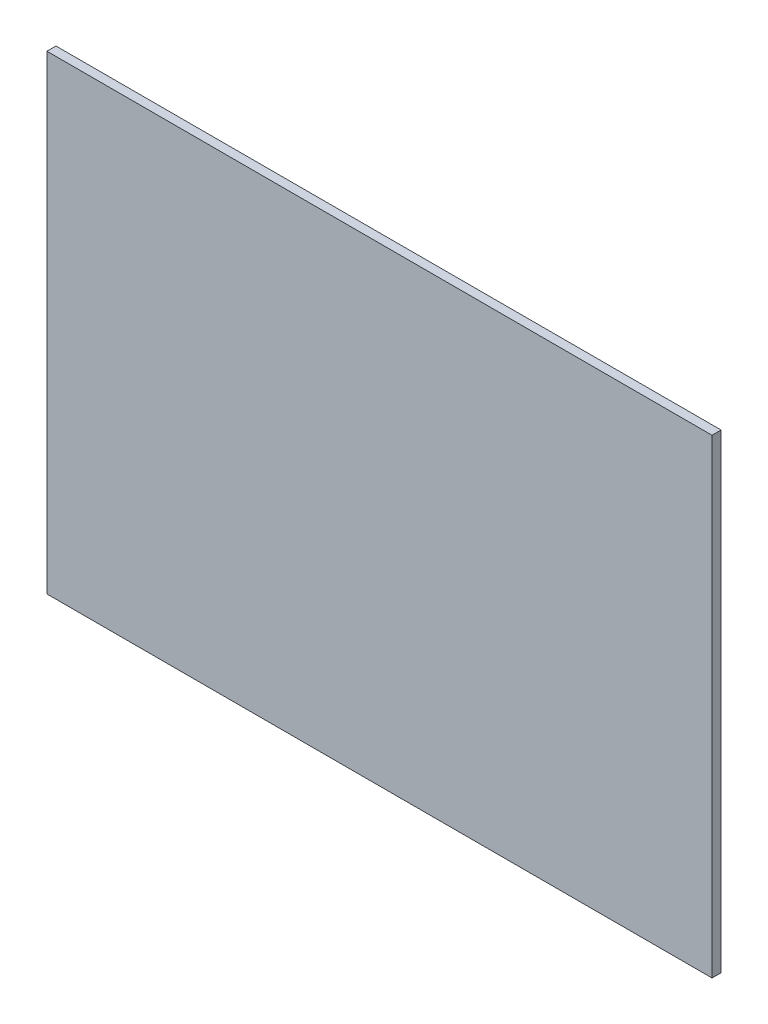
ISO-10303-21;
HEADER;
FILE_DESCRIPTION(('STEP AP214'),'2;1');
FILE_NAME('part.step','',(''),(''),'','','');
FILE_SCHEMA(('AUTOMOTIVE_DESIGN { 1 0 10303 214 1 1 1 1 }'));
ENDSEC;
DATA;
#1=APPLICATION_CONTEXT('core data for automotive mechanical design processes');
#2=APPLICATION_PROTOCOL_DEFINITION('international standard','automotive_design',2000,#1);
#3=PRODUCT_CONTEXT('',#1,'mechanical');
#4=PRODUCT('Part','Part','',(#3));
#5=PRODUCT_RELATED_PRODUCT_CATEGORY('part','',(#4));
#6=PRODUCT_DEFINITION_FORMATION('','',#4);
#7=PRODUCT_DEFINITION_CONTEXT('part definition',#1,'design');
#8=PRODUCT_DEFINITION('design','',#6,#7);
#9=PRODUCT_DEFINITION_SHAPE('','',#8);
#10=(LENGTH_UNIT() NAMED_UNIT(*) SI_UNIT(.MILLI.,.METRE.));
#11=(NAMED_UNIT(*) PLANE_ANGLE_UNIT() SI_UNIT($,.RADIAN.));
#12=(NAMED_UNIT(*) SI_UNIT($,.STERADIAN.) SOLID_ANGLE_UNIT());
#13=UNCERTAINTY_MEASURE_WITH_UNIT(LENGTH_MEASURE(1.E-05),#10,'distance_accuracy_value','');
#14=(GEOMETRIC_REPRESENTATION_CONTEXT(3) GLOBAL_UNCERTAINTY_ASSIGNED_CONTEXT((#13)) GLOBAL_UNIT_ASSIGNED_CONTEXT((#10,
#11,#12)) REPRESENTATION_CONTEXT('',''));
#15=CARTESIAN_POINT('',(0.,0.,0.));
#16=DIRECTION('',(0.,0.,1.));
#17=DIRECTION('',(1.,0.,0.));
#18=AXIS2_PLACEMENT_3D('',#15,#16,#17);
#19=CARTESIAN_POINT('',(36.79,-26.,1.));
#20=DIRECTION('',(-1.,0.,0.));
#21=DIRECTION('',(0.,0.,1.));
#22=AXIS2_PLACEMENT_3D('',#19,#20,#21);
#23=PLANE('',#22);
#24=DIRECTION('',(0.,1.,0.));
#25=VECTOR('',#24,1.);
#26=CARTESIAN_POINT('',(36.79,-26.,0.));
#27=LINE('',#26,#25);
#28=CARTESIAN_POINT('',(36.79,-26.,0.));
#29=VERTEX_POINT('',#28);
#30=CARTESIAN_POINT('',(36.79,26.,0.));
#31=VERTEX_POINT('',#30);
#32=EDGE_CURVE('E96',#29,#31,#27,.T.);
#33=ORIENTED_EDGE('',*,*,#32,.T.);
#34=DIRECTION('',(0.,0.,-1.));
#35=VECTOR('',#34,1.);
#36=CARTESIAN_POINT('',(36.79,26.,1.));
#37=LINE('',#36,#35);
#38=CARTESIAN_POINT('',(36.79,26.,1.));
#39=VERTEX_POINT('',#38);
#40=EDGE_CURVE('E11',#39,#31,#37,.T.);
#41=ORIENTED_EDGE('',*,*,#40,.F.);
#42=DIRECTION('',(0.,1.,0.));
#43=VECTOR('',#42,1.);
#44=CARTESIAN_POINT('',(36.79,-26.,1.));
#45=LINE('',#44,#43);
#46=CARTESIAN_POINT('',(36.79,-26.,1.));
#47=VERTEX_POINT('',#46);
#48=EDGE_CURVE('E84',#47,#39,#45,.T.);
#49=ORIENTED_EDGE('',*,*,#48,.F.);
#50=DIRECTION('',(0.,0.,-1.));
#51=VECTOR('',#50,1.);
#52=CARTESIAN_POINT('',(36.79,-26.,1.));
#53=LINE('',#52,#51);
#54=EDGE_CURVE('E92',#47,#29,#53,.T.);
#55=ORIENTED_EDGE('',*,*,#54,.T.);
#56=EDGE_LOOP('',(#33,#41,#49,#55));
#57=FACE_BOUND('',#56,.T.);
#58=ADVANCED_FACE('F33',(#57),#23,.F.);
#59=CARTESIAN_POINT('',(-36.79,26.,1.));
#60=DIRECTION('',(0.,-1.,0.));
#61=DIRECTION('',(0.,0.,-1.));
#62=AXIS2_PLACEMENT_3D('',#59,#60,#61);
#63=PLANE('',#62);
#64=DIRECTION('',(-1.,0.,0.));
#65=VECTOR('',#64,1.);
#66=CARTESIAN_POINT('',(-36.79,26.,0.));
#67=LINE('',#66,#65);
#68=CARTESIAN_POINT('',(-36.79,26.,0.));
#69=VERTEX_POINT('',#68);
#70=EDGE_CURVE('E88',#31,#69,#67,.T.);
#71=ORIENTED_EDGE('',*,*,#70,.T.);
#72=DIRECTION('',(0.,0.,-1.));
#73=VECTOR('',#72,1.);
#74=CARTESIAN_POINT('',(-36.79,26.,1.));
#75=LINE('',#74,#73);
#76=CARTESIAN_POINT('',(-36.79,26.,1.));
#77=VERTEX_POINT('',#76);
#78=EDGE_CURVE('E41',#77,#69,#75,.T.);
#79=ORIENTED_EDGE('',*,*,#78,.F.);
#80=DIRECTION('',(-1.,0.,0.));
#81=VECTOR('',#80,1.);
#82=CARTESIAN_POINT('',(-36.79,26.,1.));
#83=LINE('',#82,#81);
#84=EDGE_CURVE('E79',#39,#77,#83,.T.);
#85=ORIENTED_EDGE('',*,*,#84,.F.);
#86=ORIENTED_EDGE('',*,*,#40,.T.);
#87=EDGE_LOOP('',(#71,#79,#85,#86));
#88=FACE_BOUND('',#87,.T.);
#89=ADVANCED_FACE('F87',(#88),#63,.F.);
#90=CARTESIAN_POINT('',(-36.79,-26.,1.));
#91=DIRECTION('',(1.,0.,0.));
#92=DIRECTION('',(0.,0.,-1.));
#93=AXIS2_PLACEMENT_3D('',#90,#91,#92);
#94=PLANE('',#93);
#95=DIRECTION('',(0.,-1.,0.));
#96=VECTOR('',#95,1.);
#97=CARTESIAN_POINT('',(-36.79,-26.,0.));
#98=LINE('',#97,#96);
#99=CARTESIAN_POINT('',(-36.79,-26.,0.));
#100=VERTEX_POINT('',#99);
#101=EDGE_CURVE('E66',#69,#100,#98,.T.);
#102=ORIENTED_EDGE('',*,*,#101,.T.);
#103=DIRECTION('',(0.,0.,-1.));
#104=VECTOR('',#103,1.);
#105=CARTESIAN_POINT('',(-36.79,-26.,1.));
#106=LINE('',#105,#104);
#107=CARTESIAN_POINT('',(-36.79,-26.,1.));
#108=VERTEX_POINT('',#107);
#109=EDGE_CURVE('E89',#108,#100,#106,.T.);
#110=ORIENTED_EDGE('',*,*,#109,.F.);
#111=DIRECTION('',(0.,-1.,0.));
#112=VECTOR('',#111,1.);
#113=CARTESIAN_POINT('',(-36.79,-26.,1.));
#114=LINE('',#113,#112);
#115=EDGE_CURVE('E82',#77,#108,#114,.T.);
#116=ORIENTED_EDGE('',*,*,#115,.F.);
#117=ORIENTED_EDGE('',*,*,#78,.T.);
#118=EDGE_LOOP('',(#102,#110,#116,#117));
#119=FACE_BOUND('',#118,.T.);
#120=ADVANCED_FACE('F90',(#119),#94,.F.);
#121=CARTESIAN_POINT('',(-36.79,-26.,1.));
#122=DIRECTION('',(0.,1.,0.));
#123=DIRECTION('',(0.,0.,1.));
#124=AXIS2_PLACEMENT_3D('',#121,#122,#123);
#125=PLANE('',#124);
#126=DIRECTION('',(1.,0.,0.));
#127=VECTOR('',#126,1.);
#128=CARTESIAN_POINT('',(-36.79,-26.,0.));
#129=LINE('',#128,#127);
#130=EDGE_CURVE('E72',#100,#29,#129,.T.);
#131=ORIENTED_EDGE('',*,*,#130,.T.);
#132=ORIENTED_EDGE('',*,*,#54,.F.);
#133=DIRECTION('',(1.,0.,0.));
#134=VECTOR('',#133,1.);
#135=CARTESIAN_POINT('',(-36.79,-26.,1.));
#136=LINE('',#135,#134);
#137=EDGE_CURVE('E49',#108,#47,#136,.T.);
#138=ORIENTED_EDGE('',*,*,#137,.F.);
#139=ORIENTED_EDGE('',*,*,#109,.T.);
#140=EDGE_LOOP('',(#131,#132,#138,#139));
#141=FACE_BOUND('',#140,.T.);
#142=ADVANCED_FACE('F103',(#141),#125,.F.);
#143=CARTESIAN_POINT('',(0.,0.,1.));
#144=DIRECTION('',(0.,0.,-1.));
#145=DIRECTION('',(-1.,0.,0.));
#146=AXIS2_PLACEMENT_3D('',#143,#144,#145);
#147=PLANE('',#146);
#148=ORIENTED_EDGE('',*,*,#48,.T.);
#149=ORIENTED_EDGE('',*,*,#84,.T.);
#150=ORIENTED_EDGE('',*,*,#115,.T.);
#151=ORIENTED_EDGE('',*,*,#137,.T.);
#152=EDGE_LOOP('',(#148,#149,#150,#151));
#153=FACE_BOUND('',#152,.T.);
#154=ADVANCED_FACE('F80',(#153),#147,.F.);
#155=CARTESIAN_POINT('',(0.,0.,0.));
#156=DIRECTION('',(0.,0.,-1.));
#157=DIRECTION('',(-1.,0.,0.));
#158=AXIS2_PLACEMENT_3D('',#155,#156,#157);
#159=PLANE('',#158);
#160=ORIENTED_EDGE('',*,*,#32,.F.);
#161=ORIENTED_EDGE('',*,*,#130,.F.);
#162=ORIENTED_EDGE('',*,*,#101,.F.);
#163=ORIENTED_EDGE('',*,*,#70,.F.);
#164=EDGE_LOOP('',(#160,#161,#162,#163));
#165=FACE_BOUND('',#164,.T.);
#166=ADVANCED_FACE('F106',(#165),#159,.T.);
#167=CLOSED_SHELL('',(#58,#89,#120,#142,#154,#166));
#168=MANIFOLD_SOLID_BREP('B2',#167);
#169=ADVANCED_BREP_SHAPE_REPRESENTATION('',(#18,#168),#14);
#170=SHAPE_DEFINITION_REPRESENTATION(#9,#169);
ENDSEC;
END-ISO-10303-21;
